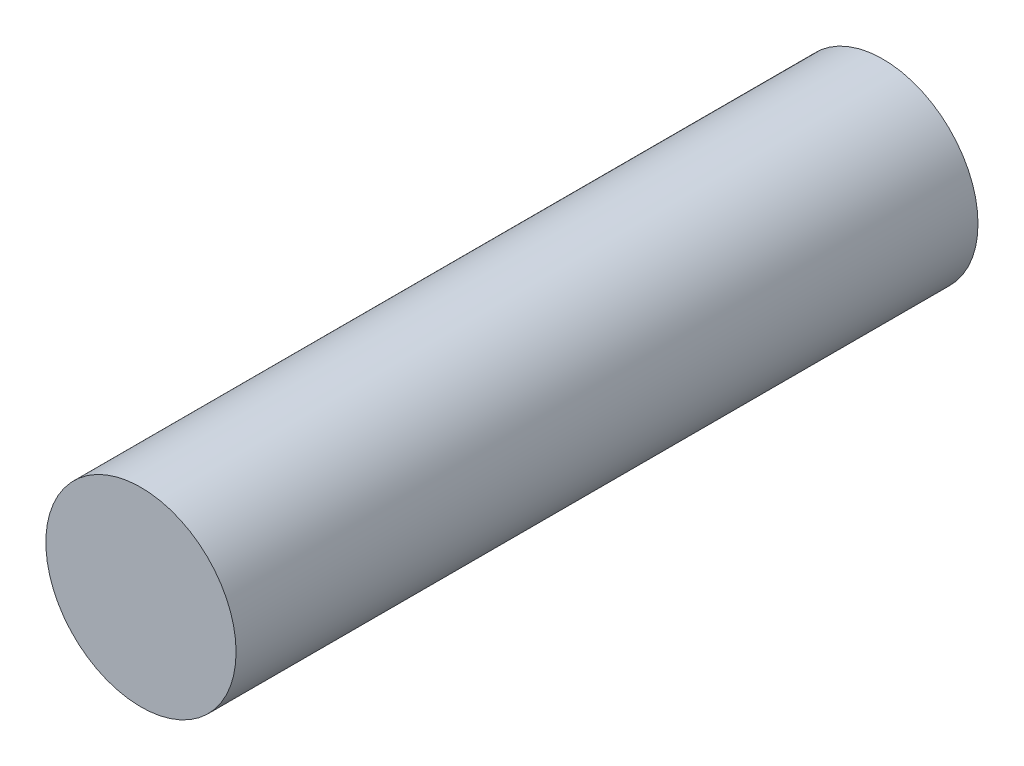
ISO-10303-21;
HEADER;
FILE_DESCRIPTION(('STEP AP214'),'2;1');
FILE_NAME('part.step','',(''),(''),'','','');
FILE_SCHEMA(('AUTOMOTIVE_DESIGN { 1 0 10303 214 1 1 1 1 }'));
ENDSEC;
DATA;
#1=APPLICATION_CONTEXT('core data for automotive mechanical design processes');
#2=APPLICATION_PROTOCOL_DEFINITION('international standard','automotive_design',2000,#1);
#3=PRODUCT_CONTEXT('',#1,'mechanical');
#4=PRODUCT('Part','Part','',(#3));
#5=PRODUCT_RELATED_PRODUCT_CATEGORY('part','',(#4));
#6=PRODUCT_DEFINITION_FORMATION('','',#4);
#7=PRODUCT_DEFINITION_CONTEXT('part definition',#1,'design');
#8=PRODUCT_DEFINITION('design','',#6,#7);
#9=PRODUCT_DEFINITION_SHAPE('','',#8);
#10=(LENGTH_UNIT() NAMED_UNIT(*) SI_UNIT(.MILLI.,.METRE.));
#11=(NAMED_UNIT(*) PLANE_ANGLE_UNIT() SI_UNIT($,.RADIAN.));
#12=(NAMED_UNIT(*) SI_UNIT($,.STERADIAN.) SOLID_ANGLE_UNIT());
#13=UNCERTAINTY_MEASURE_WITH_UNIT(LENGTH_MEASURE(1.E-05),#10,'distance_accuracy_value','');
#14=(GEOMETRIC_REPRESENTATION_CONTEXT(3) GLOBAL_UNCERTAINTY_ASSIGNED_CONTEXT((#13)) GLOBAL_UNIT_ASSIGNED_CONTEXT((#10,
#11,#12)) REPRESENTATION_CONTEXT('',''));
#15=CARTESIAN_POINT('',(0.,0.,0.));
#16=DIRECTION('',(0.,0.,1.));
#17=DIRECTION('',(1.,0.,0.));
#18=AXIS2_PLACEMENT_3D('',#15,#16,#17);
#19=CARTESIAN_POINT('',(11.1226611160805,-5.73115456988572,-0.605067499104026));
#20=DIRECTION('',(0.,0.,1.00000000000001));
#21=DIRECTION('',(1.00000000000007,1.18953458194682E-13,0.));
#22=AXIS2_PLACEMENT_3D('',#19,#20,#21);
#23=CYLINDRICAL_SURFACE('',#22,1.);
#24=CARTESIAN_POINT('',(11.1226611160805,-5.73115456988572,-0.605067499104026));
#25=DIRECTION('',(0.,0.,1.00000000000001));
#26=DIRECTION('',(1.00000000000007,1.18953458194682E-13,0.));
#27=AXIS2_PLACEMENT_3D('',#24,#25,#26);
#28=CIRCLE('',#27,1.);
#29=CARTESIAN_POINT('',(12.1226611160805,-5.7311545698856,-0.605067499103996));
#30=VERTEX_POINT('',#29);
#31=EDGE_CURVE('E10',#30,#30,#28,.T.);
#32=ORIENTED_EDGE('',*,*,#31,.T.);
#33=EDGE_LOOP('',(#32));
#34=FACE_BOUND('',#33,.T.);
#35=CARTESIAN_POINT('',(11.1226611160806,-5.73115456988551,7.19493250089621));
#36=DIRECTION('',(0.,0.,1.00000000000001));
#37=DIRECTION('',(1.00000000000007,1.18953458194682E-13,0.));
#38=AXIS2_PLACEMENT_3D('',#35,#36,#37);
#39=CIRCLE('',#38,1.);
#40=CARTESIAN_POINT('',(12.1226611160807,-5.73115456988539,7.19493250089624));
#41=VERTEX_POINT('',#40);
#42=EDGE_CURVE('E37',#41,#41,#39,.T.);
#43=ORIENTED_EDGE('',*,*,#42,.F.);
#44=EDGE_LOOP('',(#43));
#45=FACE_BOUND('',#44,.T.);
#46=ADVANCED_FACE('F31',(#34,#45),#23,.T.);
#47=CARTESIAN_POINT('',(11.1226611160805,-5.73115456988572,-0.605067499104026));
#48=DIRECTION('',(0.,0.,1.00000000000001));
#49=DIRECTION('',(1.00000000000007,1.18953458194682E-13,0.));
#50=AXIS2_PLACEMENT_3D('',#47,#48,#49);
#51=PLANE('',#50);
#52=ORIENTED_EDGE('',*,*,#31,.F.);
#53=EDGE_LOOP('',(#52));
#54=FACE_BOUND('',#53,.T.);
#55=ADVANCED_FACE('F46',(#54),#51,.F.);
#56=CARTESIAN_POINT('',(11.1226611160806,-5.73115456988551,7.19493250089621));
#57=DIRECTION('',(0.,0.,1.00000000000001));
#58=DIRECTION('',(1.00000000000007,1.18953458194682E-13,0.));
#59=AXIS2_PLACEMENT_3D('',#56,#57,#58);
#60=PLANE('',#59);
#61=ORIENTED_EDGE('',*,*,#42,.T.);
#62=EDGE_LOOP('',(#61));
#63=FACE_BOUND('',#62,.T.);
#64=ADVANCED_FACE('F43',(#63),#60,.T.);
#65=CLOSED_SHELL('',(#46,#55,#64));
#66=MANIFOLD_SOLID_BREP('B2',#65);
#67=ADVANCED_BREP_SHAPE_REPRESENTATION('',(#18,#66),#14);
#68=SHAPE_DEFINITION_REPRESENTATION(#9,#67);
ENDSEC;
END-ISO-10303-21;
